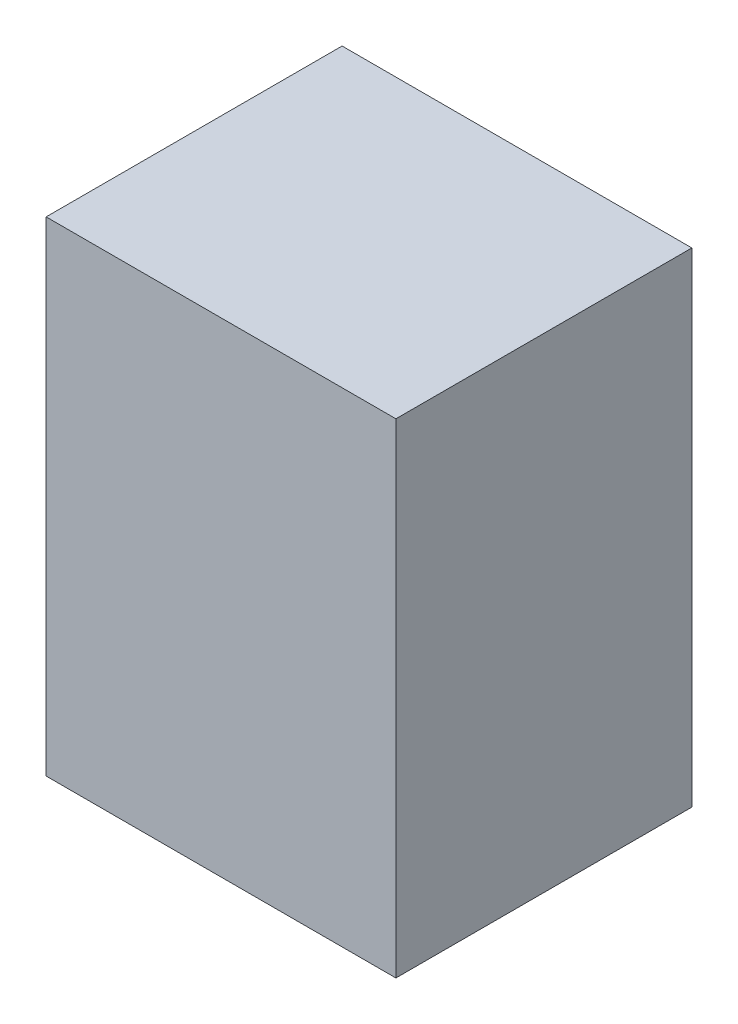
ISO-10303-21;
HEADER;
FILE_DESCRIPTION(('STEP AP214'),'2;1');
FILE_NAME('part.step','',(''),(''),'','','');
FILE_SCHEMA(('AUTOMOTIVE_DESIGN { 1 0 10303 214 1 1 1 1 }'));
ENDSEC;
DATA;
#1=APPLICATION_CONTEXT('core data for automotive mechanical design processes');
#2=APPLICATION_PROTOCOL_DEFINITION('international standard','automotive_design',2000,#1);
#3=PRODUCT_CONTEXT('',#1,'mechanical');
#4=PRODUCT('Part','Part','',(#3));
#5=PRODUCT_RELATED_PRODUCT_CATEGORY('part','',(#4));
#6=PRODUCT_DEFINITION_FORMATION('','',#4);
#7=PRODUCT_DEFINITION_CONTEXT('part definition',#1,'design');
#8=PRODUCT_DEFINITION('design','',#6,#7);
#9=PRODUCT_DEFINITION_SHAPE('','',#8);
#10=(LENGTH_UNIT() NAMED_UNIT(*) SI_UNIT(.MILLI.,.METRE.));
#11=(NAMED_UNIT(*) PLANE_ANGLE_UNIT() SI_UNIT($,.RADIAN.));
#12=(NAMED_UNIT(*) SI_UNIT($,.STERADIAN.) SOLID_ANGLE_UNIT());
#13=UNCERTAINTY_MEASURE_WITH_UNIT(LENGTH_MEASURE(1.E-05),#10,'distance_accuracy_value','');
#14=(GEOMETRIC_REPRESENTATION_CONTEXT(3) GLOBAL_UNCERTAINTY_ASSIGNED_CONTEXT((#13)) GLOBAL_UNIT_ASSIGNED_CONTEXT((#10,
#11,#12)) REPRESENTATION_CONTEXT('',''));
#15=CARTESIAN_POINT('',(0.,0.,0.));
#16=DIRECTION('',(0.,0.,1.));
#17=DIRECTION('',(1.,0.,0.));
#18=AXIS2_PLACEMENT_3D('',#15,#16,#17);
#19=CARTESIAN_POINT('',(-9.,5.,3.));
#20=DIRECTION('',(0.,0.,-1.));
#21=DIRECTION('',(1.,0.,0.));
#22=AXIS2_PLACEMENT_3D('',#19,#20,#21);
#23=PLANE('',#22);
#24=DIRECTION('',(0.,-1.,0.));
#25=VECTOR('',#24,1.);
#26=CARTESIAN_POINT('',(-9.,23.,3.));
#27=LINE('',#26,#25);
#28=CARTESIAN_POINT('',(-9.,23.,3.));
#29=VERTEX_POINT('',#28);
#30=CARTESIAN_POINT('',(-9.,5.,3.));
#31=VERTEX_POINT('',#30);
#32=EDGE_CURVE('E45',#29,#31,#27,.T.);
#33=ORIENTED_EDGE('',*,*,#32,.F.);
#34=DIRECTION('',(-1.,0.,0.));
#35=VECTOR('',#34,1.);
#36=CARTESIAN_POINT('',(4.,23.,3.));
#37=LINE('',#36,#35);
#38=CARTESIAN_POINT('',(4.,23.,3.));
#39=VERTEX_POINT('',#38);
#40=EDGE_CURVE('E44',#39,#29,#37,.T.);
#41=ORIENTED_EDGE('',*,*,#40,.F.);
#42=DIRECTION('',(0.,1.,0.));
#43=VECTOR('',#42,1.);
#44=CARTESIAN_POINT('',(4.,5.,3.));
#45=LINE('',#44,#43);
#46=CARTESIAN_POINT('',(4.,5.,3.));
#47=VERTEX_POINT('',#46);
#48=EDGE_CURVE('E43',#47,#39,#45,.T.);
#49=ORIENTED_EDGE('',*,*,#48,.F.);
#50=DIRECTION('',(1.,0.,0.));
#51=VECTOR('',#50,1.);
#52=CARTESIAN_POINT('',(-9.,5.,3.));
#53=LINE('',#52,#51);
#54=EDGE_CURVE('E42',#31,#47,#53,.T.);
#55=ORIENTED_EDGE('',*,*,#54,.F.);
#56=EDGE_LOOP('',(#33,#41,#49,#55));
#57=FACE_BOUND('',#56,.T.);
#58=ADVANCED_FACE('F6',(#57),#23,.T.);
#59=CARTESIAN_POINT('',(-9.,5.,14.));
#60=DIRECTION('',(0.,0.,1.));
#61=DIRECTION('',(1.,0.,0.));
#62=AXIS2_PLACEMENT_3D('',#59,#60,#61);
#63=PLANE('',#62);
#64=DIRECTION('',(1.,0.,0.));
#65=VECTOR('',#64,1.);
#66=CARTESIAN_POINT('',(-9.,5.,14.));
#67=LINE('',#66,#65);
#68=CARTESIAN_POINT('',(-9.,5.,14.));
#69=VERTEX_POINT('',#68);
#70=CARTESIAN_POINT('',(4.,5.,14.));
#71=VERTEX_POINT('',#70);
#72=EDGE_CURVE('E46',#69,#71,#67,.T.);
#73=ORIENTED_EDGE('',*,*,#72,.T.);
#74=DIRECTION('',(0.,1.,0.));
#75=VECTOR('',#74,1.);
#76=CARTESIAN_POINT('',(4.,5.,14.));
#77=LINE('',#76,#75);
#78=CARTESIAN_POINT('',(4.,23.,14.));
#79=VERTEX_POINT('',#78);
#80=EDGE_CURVE('E47',#71,#79,#77,.T.);
#81=ORIENTED_EDGE('',*,*,#80,.T.);
#82=DIRECTION('',(-1.,0.,0.));
#83=VECTOR('',#82,1.);
#84=CARTESIAN_POINT('',(4.,23.,14.));
#85=LINE('',#84,#83);
#86=CARTESIAN_POINT('',(-9.,23.,14.));
#87=VERTEX_POINT('',#86);
#88=EDGE_CURVE('E48',#79,#87,#85,.T.);
#89=ORIENTED_EDGE('',*,*,#88,.T.);
#90=DIRECTION('',(0.,-1.,0.));
#91=VECTOR('',#90,1.);
#92=CARTESIAN_POINT('',(-9.,23.,14.));
#93=LINE('',#92,#91);
#94=EDGE_CURVE('E49',#87,#69,#93,.T.);
#95=ORIENTED_EDGE('',*,*,#94,.T.);
#96=EDGE_LOOP('',(#73,#81,#89,#95));
#97=FACE_BOUND('',#96,.T.);
#98=ADVANCED_FACE('F12',(#97),#63,.T.);
#99=CARTESIAN_POINT('',(-9.,5.,3.));
#100=DIRECTION('',(0.,-1.,0.));
#101=DIRECTION('',(1.,0.,0.));
#102=AXIS2_PLACEMENT_3D('',#99,#100,#101);
#103=PLANE('',#102);
#104=ORIENTED_EDGE('',*,*,#54,.T.);
#105=DIRECTION('',(0.,0.,1.));
#106=VECTOR('',#105,1.);
#107=CARTESIAN_POINT('',(4.,5.,3.));
#108=LINE('',#107,#106);
#109=EDGE_CURVE('E51',#47,#71,#108,.T.);
#110=ORIENTED_EDGE('',*,*,#109,.T.);
#111=ORIENTED_EDGE('',*,*,#72,.F.);
#112=DIRECTION('',(0.,0.,1.));
#113=VECTOR('',#112,1.);
#114=CARTESIAN_POINT('',(-9.,5.,3.));
#115=LINE('',#114,#113);
#116=EDGE_CURVE('E50',#31,#69,#115,.T.);
#117=ORIENTED_EDGE('',*,*,#116,.F.);
#118=EDGE_LOOP('',(#104,#110,#111,#117));
#119=FACE_BOUND('',#118,.T.);
#120=ADVANCED_FACE('F18',(#119),#103,.T.);
#121=CARTESIAN_POINT('',(4.,5.,3.));
#122=DIRECTION('',(1.,0.,0.));
#123=DIRECTION('',(0.,1.,0.));
#124=AXIS2_PLACEMENT_3D('',#121,#122,#123);
#125=PLANE('',#124);
#126=ORIENTED_EDGE('',*,*,#48,.T.);
#127=DIRECTION('',(0.,0.,1.));
#128=VECTOR('',#127,1.);
#129=CARTESIAN_POINT('',(4.,23.,3.));
#130=LINE('',#129,#128);
#131=EDGE_CURVE('E52',#39,#79,#130,.T.);
#132=ORIENTED_EDGE('',*,*,#131,.T.);
#133=ORIENTED_EDGE('',*,*,#80,.F.);
#134=ORIENTED_EDGE('',*,*,#109,.F.);
#135=EDGE_LOOP('',(#126,#132,#133,#134));
#136=FACE_BOUND('',#135,.T.);
#137=ADVANCED_FACE('F24',(#136),#125,.T.);
#138=CARTESIAN_POINT('',(4.,23.,3.));
#139=DIRECTION('',(0.,1.,0.));
#140=DIRECTION('',(-1.,0.,0.));
#141=AXIS2_PLACEMENT_3D('',#138,#139,#140);
#142=PLANE('',#141);
#143=ORIENTED_EDGE('',*,*,#40,.T.);
#144=DIRECTION('',(0.,0.,1.));
#145=VECTOR('',#144,1.);
#146=CARTESIAN_POINT('',(-9.,23.,3.));
#147=LINE('',#146,#145);
#148=EDGE_CURVE('E53',#29,#87,#147,.T.);
#149=ORIENTED_EDGE('',*,*,#148,.T.);
#150=ORIENTED_EDGE('',*,*,#88,.F.);
#151=ORIENTED_EDGE('',*,*,#131,.F.);
#152=EDGE_LOOP('',(#143,#149,#150,#151));
#153=FACE_BOUND('',#152,.T.);
#154=ADVANCED_FACE('F30',(#153),#142,.T.);
#155=CARTESIAN_POINT('',(-9.,23.,3.));
#156=DIRECTION('',(-1.,0.,0.));
#157=DIRECTION('',(0.,-1.,0.));
#158=AXIS2_PLACEMENT_3D('',#155,#156,#157);
#159=PLANE('',#158);
#160=ORIENTED_EDGE('',*,*,#32,.T.);
#161=ORIENTED_EDGE('',*,*,#116,.T.);
#162=ORIENTED_EDGE('',*,*,#94,.F.);
#163=ORIENTED_EDGE('',*,*,#148,.F.);
#164=EDGE_LOOP('',(#160,#161,#162,#163));
#165=FACE_BOUND('',#164,.T.);
#166=ADVANCED_FACE('F36',(#165),#159,.T.);
#167=CLOSED_SHELL('',(#58,#98,#120,#137,#154,#166));
#168=MANIFOLD_SOLID_BREP('B1',#167);
#169=ADVANCED_BREP_SHAPE_REPRESENTATION('',(#18,#168),#14);
#170=SHAPE_DEFINITION_REPRESENTATION(#9,#169);
ENDSEC;
END-ISO-10303-21;
